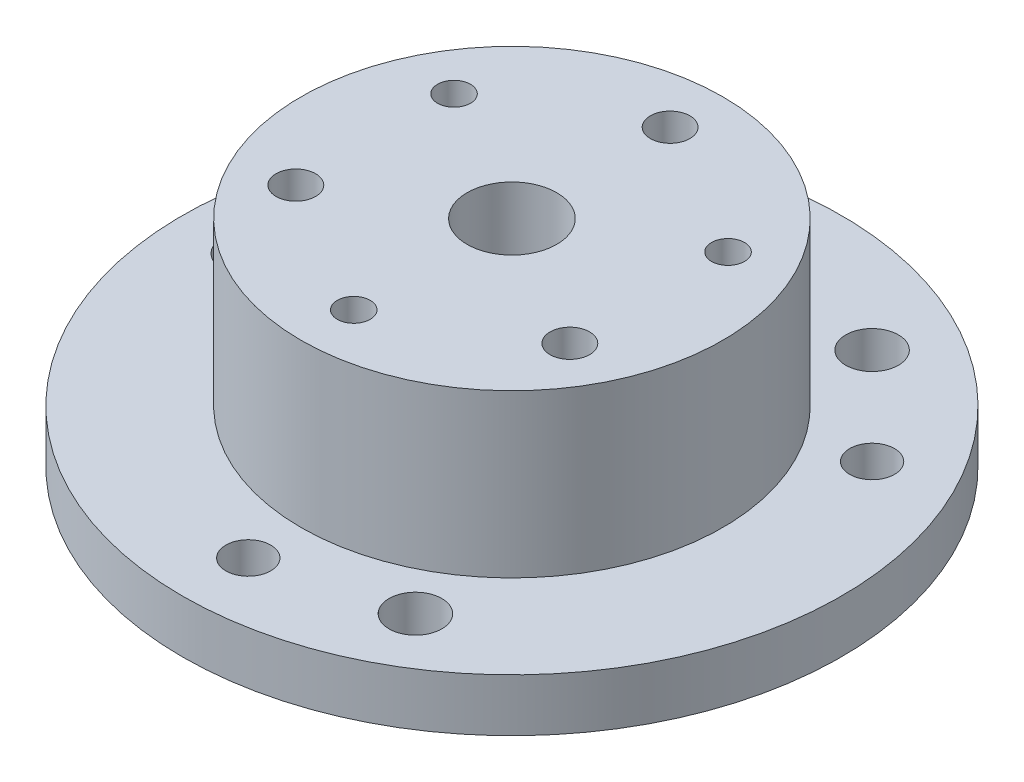
ISO-10303-21;
HEADER;
FILE_DESCRIPTION(('STEP AP214'),'2;1');
FILE_NAME('part.step','',(''),(''),'','','');
FILE_SCHEMA(('AUTOMOTIVE_DESIGN { 1 0 10303 214 1 1 1 1 }'));
ENDSEC;
DATA;
#1=APPLICATION_CONTEXT('core data for automotive mechanical design processes');
#2=APPLICATION_PROTOCOL_DEFINITION('international standard','automotive_design',2000,#1);
#3=PRODUCT_CONTEXT('',#1,'mechanical');
#4=PRODUCT('Part','Part','',(#3));
#5=PRODUCT_RELATED_PRODUCT_CATEGORY('part','',(#4));
#6=PRODUCT_DEFINITION_FORMATION('','',#4);
#7=PRODUCT_DEFINITION_CONTEXT('part definition',#1,'design');
#8=PRODUCT_DEFINITION('design','',#6,#7);
#9=PRODUCT_DEFINITION_SHAPE('','',#8);
#10=(LENGTH_UNIT() NAMED_UNIT(*) SI_UNIT(.MILLI.,.METRE.));
#11=(NAMED_UNIT(*) PLANE_ANGLE_UNIT() SI_UNIT($,.RADIAN.));
#12=(NAMED_UNIT(*) SI_UNIT($,.STERADIAN.) SOLID_ANGLE_UNIT());
#13=UNCERTAINTY_MEASURE_WITH_UNIT(LENGTH_MEASURE(1.E-05),#10,'distance_accuracy_value','');
#14=(GEOMETRIC_REPRESENTATION_CONTEXT(3) GLOBAL_UNCERTAINTY_ASSIGNED_CONTEXT((#13)) GLOBAL_UNIT_ASSIGNED_CONTEXT((#10,
#11,#12)) REPRESENTATION_CONTEXT('',''));
#15=CARTESIAN_POINT('',(0.,0.,0.));
#16=DIRECTION('',(0.,0.,1.));
#17=DIRECTION('',(1.,0.,0.));
#18=AXIS2_PLACEMENT_3D('',#15,#16,#17);
#19=CARTESIAN_POINT('',(0.,4.,0.));
#20=DIRECTION('',(0.,-1.,0.));
#21=DIRECTION('',(0.,0.,-1.));
#22=AXIS2_PLACEMENT_3D('',#19,#20,#21);
#23=CYLINDRICAL_SURFACE('',#22,25.);
#24=CARTESIAN_POINT('',(0.,4.,0.));
#25=DIRECTION('',(0.,1.,0.));
#26=DIRECTION('',(0.,0.,1.));
#27=AXIS2_PLACEMENT_3D('',#24,#25,#26);
#28=CIRCLE('',#27,25.);
#29=CARTESIAN_POINT('',(0.,4.,25.));
#30=VERTEX_POINT('',#29);
#31=EDGE_CURVE('E10',#30,#30,#28,.T.);
#32=ORIENTED_EDGE('',*,*,#31,.F.);
#33=EDGE_LOOP('',(#32));
#34=FACE_BOUND('',#33,.T.);
#35=CARTESIAN_POINT('',(0.,0.,0.));
#36=DIRECTION('',(0.,1.,0.));
#37=DIRECTION('',(0.,0.,1.));
#38=AXIS2_PLACEMENT_3D('',#35,#36,#37);
#39=CIRCLE('',#38,25.);
#40=CARTESIAN_POINT('',(0.,0.,25.));
#41=VERTEX_POINT('',#40);
#42=EDGE_CURVE('E48',#41,#41,#39,.T.);
#43=ORIENTED_EDGE('',*,*,#42,.T.);
#44=EDGE_LOOP('',(#43));
#45=FACE_BOUND('',#44,.T.);
#46=ADVANCED_FACE('F45',(#34,#45),#23,.T.);
#47=CARTESIAN_POINT('',(0.,4.,0.));
#48=DIRECTION('',(0.,1.,0.));
#49=DIRECTION('',(0.,0.,1.));
#50=AXIS2_PLACEMENT_3D('',#47,#48,#49);
#51=PLANE('',#50);
#52=CARTESIAN_POINT('',(0.,4.,0.));
#53=DIRECTION('',(0.,1.,0.));
#54=DIRECTION('',(0.,0.,1.));
#55=AXIS2_PLACEMENT_3D('',#52,#53,#54);
#56=CIRCLE('',#55,16.);
#57=CARTESIAN_POINT('',(0.,4.,16.));
#58=VERTEX_POINT('',#57);
#59=EDGE_CURVE('E106',#58,#58,#56,.F.);
#60=ORIENTED_EDGE('',*,*,#59,.T.);
#61=EDGE_LOOP('',(#60));
#62=FACE_BOUND('',#61,.T.);
#63=CARTESIAN_POINT('',(0.,4.,20.));
#64=DIRECTION('',(0.,1.,0.));
#65=DIRECTION('',(0.,0.,1.));
#66=AXIS2_PLACEMENT_3D('',#63,#64,#65);
#67=CIRCLE('',#66,1.7);
#68=CARTESIAN_POINT('',(0.,4.,21.7));
#69=VERTEX_POINT('',#68);
#70=EDGE_CURVE('E102',#69,#69,#67,.T.);
#71=ORIENTED_EDGE('',*,*,#70,.F.);
#72=EDGE_LOOP('',(#71));
#73=FACE_BOUND('',#72,.T.);
#74=CARTESIAN_POINT('',(-17.3205080756887,4.,-10.0000000000001));
#75=DIRECTION('',(0.,1.,0.));
#76=DIRECTION('',(0.,0.,1.));
#77=AXIS2_PLACEMENT_3D('',#74,#75,#76);
#78=CIRCLE('',#77,1.7);
#79=CARTESIAN_POINT('',(-17.3205080756887,4.,-8.30000000000008));
#80=VERTEX_POINT('',#79);
#81=EDGE_CURVE('E94',#80,#80,#78,.T.);
#82=ORIENTED_EDGE('',*,*,#81,.F.);
#83=EDGE_LOOP('',(#82));
#84=FACE_BOUND('',#83,.T.);
#85=CARTESIAN_POINT('',(17.3205080756889,4.,-9.99999999999984));
#86=DIRECTION('',(0.,1.,0.));
#87=DIRECTION('',(0.,0.,1.));
#88=AXIS2_PLACEMENT_3D('',#85,#86,#87);
#89=CIRCLE('',#88,1.7);
#90=CARTESIAN_POINT('',(17.3205080756889,4.,-8.29999999999984));
#91=VERTEX_POINT('',#90);
#92=EDGE_CURVE('E86',#91,#91,#89,.T.);
#93=ORIENTED_EDGE('',*,*,#92,.F.);
#94=EDGE_LOOP('',(#93));
#95=FACE_BOUND('',#94,.T.);
#96=CARTESIAN_POINT('',(-20.,4.,0.));
#97=DIRECTION('',(0.,1.,0.));
#98=DIRECTION('',(0.,0.,1.));
#99=AXIS2_PLACEMENT_3D('',#96,#97,#98);
#100=CIRCLE('',#99,2.);
#101=CARTESIAN_POINT('',(-20.,4.,2.));
#102=VERTEX_POINT('',#101);
#103=EDGE_CURVE('E78',#102,#102,#100,.T.);
#104=ORIENTED_EDGE('',*,*,#103,.F.);
#105=EDGE_LOOP('',(#104));
#106=FACE_BOUND('',#105,.T.);
#107=CARTESIAN_POINT('',(10.0000000000013,4.,-17.3205080756895));
#108=DIRECTION('',(0.,1.,0.));
#109=DIRECTION('',(0.,0.,1.));
#110=AXIS2_PLACEMENT_3D('',#107,#108,#109);
#111=CIRCLE('',#110,2.);
#112=CARTESIAN_POINT('',(10.0000000000013,4.,-15.3205080756895));
#113=VERTEX_POINT('',#112);
#114=EDGE_CURVE('E70',#113,#113,#111,.T.);
#115=ORIENTED_EDGE('',*,*,#114,.F.);
#116=EDGE_LOOP('',(#115));
#117=FACE_BOUND('',#116,.T.);
#118=CARTESIAN_POINT('',(10.0000000000013,4.,17.3205080756895));
#119=DIRECTION('',(0.,1.,0.));
#120=DIRECTION('',(0.,0.,1.));
#121=AXIS2_PLACEMENT_3D('',#118,#119,#120);
#122=CIRCLE('',#121,2.);
#123=CARTESIAN_POINT('',(10.0000000000013,4.,19.3205080756895));
#124=VERTEX_POINT('',#123);
#125=EDGE_CURVE('E62',#124,#124,#122,.T.);
#126=ORIENTED_EDGE('',*,*,#125,.F.);
#127=EDGE_LOOP('',(#126));
#128=FACE_BOUND('',#127,.T.);
#129=ORIENTED_EDGE('',*,*,#31,.T.);
#130=EDGE_LOOP('',(#129));
#131=FACE_BOUND('',#130,.T.);
#132=ADVANCED_FACE('F207',(#62,#73,#84,#95,#106,#117,#128,#131),#51,.T.);
#133=CARTESIAN_POINT('',(0.,0.,0.));
#134=DIRECTION('',(0.,1.,0.));
#135=DIRECTION('',(0.,0.,1.));
#136=AXIS2_PLACEMENT_3D('',#133,#134,#135);
#137=PLANE('',#136);
#138=CARTESIAN_POINT('',(0.,0.,12.));
#139=DIRECTION('',(0.,1.,0.));
#140=DIRECTION('',(0.,0.,1.));
#141=AXIS2_PLACEMENT_3D('',#138,#139,#140);
#142=CIRCLE('',#141,1.25);
#143=CARTESIAN_POINT('',(0.,0.,13.25));
#144=VERTEX_POINT('',#143);
#145=EDGE_CURVE('E162',#144,#144,#142,.T.);
#146=ORIENTED_EDGE('',*,*,#145,.T.);
#147=EDGE_LOOP('',(#146));
#148=FACE_BOUND('',#147,.T.);
#149=CARTESIAN_POINT('',(-10.3923048454132,0.,-6.00000000000005));
#150=DIRECTION('',(0.,1.,0.));
#151=DIRECTION('',(0.,0.,1.));
#152=AXIS2_PLACEMENT_3D('',#149,#150,#151);
#153=CIRCLE('',#152,1.25);
#154=CARTESIAN_POINT('',(-10.3923048454132,0.,-4.75000000000005));
#155=VERTEX_POINT('',#154);
#156=EDGE_CURVE('E154',#155,#155,#153,.T.);
#157=ORIENTED_EDGE('',*,*,#156,.T.);
#158=EDGE_LOOP('',(#157));
#159=FACE_BOUND('',#158,.T.);
#160=CARTESIAN_POINT('',(10.3923048454133,0.,-5.99999999999991));
#161=DIRECTION('',(0.,1.,0.));
#162=DIRECTION('',(0.,0.,1.));
#163=AXIS2_PLACEMENT_3D('',#160,#161,#162);
#164=CIRCLE('',#163,1.25);
#165=CARTESIAN_POINT('',(10.3923048454133,0.,-4.74999999999991));
#166=VERTEX_POINT('',#165);
#167=EDGE_CURVE('E146',#166,#166,#164,.T.);
#168=ORIENTED_EDGE('',*,*,#167,.T.);
#169=EDGE_LOOP('',(#168));
#170=FACE_BOUND('',#169,.T.);
#171=CARTESIAN_POINT('',(0.,0.,-12.));
#172=DIRECTION('',(0.,1.,0.));
#173=DIRECTION('',(0.,0.,1.));
#174=AXIS2_PLACEMENT_3D('',#171,#172,#173);
#175=CIRCLE('',#174,1.5);
#176=CARTESIAN_POINT('',(0.,0.,-10.5));
#177=VERTEX_POINT('',#176);
#178=EDGE_CURVE('E138',#177,#177,#175,.T.);
#179=ORIENTED_EDGE('',*,*,#178,.T.);
#180=EDGE_LOOP('',(#179));
#181=FACE_BOUND('',#180,.T.);
#182=CARTESIAN_POINT('',(10.392304845414,0.,5.99999999999956));
#183=DIRECTION('',(0.,1.,0.));
#184=DIRECTION('',(0.,0.,1.));
#185=AXIS2_PLACEMENT_3D('',#182,#183,#184);
#186=CIRCLE('',#185,1.5);
#187=CARTESIAN_POINT('',(10.392304845414,0.,7.49999999999955));
#188=VERTEX_POINT('',#187);
#189=EDGE_CURVE('E130',#188,#188,#186,.T.);
#190=ORIENTED_EDGE('',*,*,#189,.T.);
#191=EDGE_LOOP('',(#190));
#192=FACE_BOUND('',#191,.T.);
#193=CARTESIAN_POINT('',(-10.3923048454125,0.,6.00000000000044));
#194=DIRECTION('',(0.,1.,0.));
#195=DIRECTION('',(0.,0.,1.));
#196=AXIS2_PLACEMENT_3D('',#193,#194,#195);
#197=CIRCLE('',#196,1.5);
#198=CARTESIAN_POINT('',(-10.3923048454125,0.,7.50000000000043));
#199=VERTEX_POINT('',#198);
#200=EDGE_CURVE('E122',#199,#199,#197,.T.);
#201=ORIENTED_EDGE('',*,*,#200,.T.);
#202=EDGE_LOOP('',(#201));
#203=FACE_BOUND('',#202,.T.);
#204=CARTESIAN_POINT('',(0.,0.,0.));
#205=DIRECTION('',(0.,-1.,0.));
#206=DIRECTION('',(0.,0.,-1.));
#207=AXIS2_PLACEMENT_3D('',#204,#205,#206);
#208=CIRCLE('',#207,3.4);
#209=CARTESIAN_POINT('',(0.,0.,-3.4));
#210=VERTEX_POINT('',#209);
#211=EDGE_CURVE('E118',#210,#210,#208,.T.);
#212=ORIENTED_EDGE('',*,*,#211,.F.);
#213=EDGE_LOOP('',(#212));
#214=FACE_BOUND('',#213,.T.);
#215=CARTESIAN_POINT('',(0.,0.,20.));
#216=DIRECTION('',(0.,1.,0.));
#217=DIRECTION('',(0.,0.,1.));
#218=AXIS2_PLACEMENT_3D('',#215,#216,#217);
#219=CIRCLE('',#218,1.7);
#220=CARTESIAN_POINT('',(0.,0.,21.7));
#221=VERTEX_POINT('',#220);
#222=EDGE_CURVE('E98',#221,#221,#219,.T.);
#223=ORIENTED_EDGE('',*,*,#222,.T.);
#224=EDGE_LOOP('',(#223));
#225=FACE_BOUND('',#224,.T.);
#226=CARTESIAN_POINT('',(-17.3205080756887,0.,-10.0000000000001));
#227=DIRECTION('',(0.,1.,0.));
#228=DIRECTION('',(0.,0.,1.));
#229=AXIS2_PLACEMENT_3D('',#226,#227,#228);
#230=CIRCLE('',#229,1.7);
#231=CARTESIAN_POINT('',(-17.3205080756887,0.,-8.30000000000008));
#232=VERTEX_POINT('',#231);
#233=EDGE_CURVE('E90',#232,#232,#230,.T.);
#234=ORIENTED_EDGE('',*,*,#233,.T.);
#235=EDGE_LOOP('',(#234));
#236=FACE_BOUND('',#235,.T.);
#237=CARTESIAN_POINT('',(17.3205080756889,0.,-9.99999999999984));
#238=DIRECTION('',(0.,1.,0.));
#239=DIRECTION('',(0.,0.,1.));
#240=AXIS2_PLACEMENT_3D('',#237,#238,#239);
#241=CIRCLE('',#240,1.7);
#242=CARTESIAN_POINT('',(17.3205080756889,0.,-8.29999999999984));
#243=VERTEX_POINT('',#242);
#244=EDGE_CURVE('E82',#243,#243,#241,.T.);
#245=ORIENTED_EDGE('',*,*,#244,.T.);
#246=EDGE_LOOP('',(#245));
#247=FACE_BOUND('',#246,.T.);
#248=CARTESIAN_POINT('',(-20.,0.,0.));
#249=DIRECTION('',(0.,1.,0.));
#250=DIRECTION('',(0.,0.,1.));
#251=AXIS2_PLACEMENT_3D('',#248,#249,#250);
#252=CIRCLE('',#251,2.);
#253=CARTESIAN_POINT('',(-20.,0.,2.));
#254=VERTEX_POINT('',#253);
#255=EDGE_CURVE('E74',#254,#254,#252,.T.);
#256=ORIENTED_EDGE('',*,*,#255,.T.);
#257=EDGE_LOOP('',(#256));
#258=FACE_BOUND('',#257,.T.);
#259=CARTESIAN_POINT('',(10.0000000000013,0.,-17.3205080756895));
#260=DIRECTION('',(0.,1.,0.));
#261=DIRECTION('',(0.,0.,1.));
#262=AXIS2_PLACEMENT_3D('',#259,#260,#261);
#263=CIRCLE('',#262,2.);
#264=CARTESIAN_POINT('',(10.0000000000013,0.,-15.3205080756895));
#265=VERTEX_POINT('',#264);
#266=EDGE_CURVE('E66',#265,#265,#263,.T.);
#267=ORIENTED_EDGE('',*,*,#266,.T.);
#268=EDGE_LOOP('',(#267));
#269=FACE_BOUND('',#268,.T.);
#270=CARTESIAN_POINT('',(10.0000000000013,0.,17.3205080756895));
#271=DIRECTION('',(0.,1.,0.));
#272=DIRECTION('',(0.,0.,1.));
#273=AXIS2_PLACEMENT_3D('',#270,#271,#272);
#274=CIRCLE('',#273,2.);
#275=CARTESIAN_POINT('',(10.0000000000013,0.,19.3205080756895));
#276=VERTEX_POINT('',#275);
#277=EDGE_CURVE('E57',#276,#276,#274,.T.);
#278=ORIENTED_EDGE('',*,*,#277,.T.);
#279=EDGE_LOOP('',(#278));
#280=FACE_BOUND('',#279,.T.);
#281=ORIENTED_EDGE('',*,*,#42,.F.);
#282=EDGE_LOOP('',(#281));
#283=FACE_BOUND('',#282,.T.);
#284=ADVANCED_FACE('F212',(#148,#159,#170,#181,#192,#203,#214,#225,#236,#247,#258,#269,#280,
#283),#137,.F.);
#285=CARTESIAN_POINT('',(10.0000000000013,4.,17.3205080756895));
#286=DIRECTION('',(0.,1.,0.));
#287=DIRECTION('',(0.,0.,1.));
#288=AXIS2_PLACEMENT_3D('',#285,#286,#287);
#289=CYLINDRICAL_SURFACE('',#288,2.);
#290=ORIENTED_EDGE('',*,*,#277,.F.);
#291=EDGE_LOOP('',(#290));
#292=FACE_BOUND('',#291,.T.);
#293=ORIENTED_EDGE('',*,*,#125,.T.);
#294=EDGE_LOOP('',(#293));
#295=FACE_BOUND('',#294,.T.);
#296=ADVANCED_FACE('F219',(#292,#295),#289,.F.);
#297=CARTESIAN_POINT('',(10.0000000000013,4.,-17.3205080756895));
#298=DIRECTION('',(0.,1.,0.));
#299=DIRECTION('',(0.,0.,1.));
#300=AXIS2_PLACEMENT_3D('',#297,#298,#299);
#301=CYLINDRICAL_SURFACE('',#300,2.);
#302=ORIENTED_EDGE('',*,*,#266,.F.);
#303=EDGE_LOOP('',(#302));
#304=FACE_BOUND('',#303,.T.);
#305=ORIENTED_EDGE('',*,*,#114,.T.);
#306=EDGE_LOOP('',(#305));
#307=FACE_BOUND('',#306,.T.);
#308=ADVANCED_FACE('F224',(#304,#307),#301,.F.);
#309=CARTESIAN_POINT('',(-20.,4.,0.));
#310=DIRECTION('',(0.,1.,0.));
#311=DIRECTION('',(0.,0.,1.));
#312=AXIS2_PLACEMENT_3D('',#309,#310,#311);
#313=CYLINDRICAL_SURFACE('',#312,2.);
#314=ORIENTED_EDGE('',*,*,#255,.F.);
#315=EDGE_LOOP('',(#314));
#316=FACE_BOUND('',#315,.T.);
#317=ORIENTED_EDGE('',*,*,#103,.T.);
#318=EDGE_LOOP('',(#317));
#319=FACE_BOUND('',#318,.T.);
#320=ADVANCED_FACE('F231',(#316,#319),#313,.F.);
#321=CARTESIAN_POINT('',(17.3205080756889,4.,-9.99999999999984));
#322=DIRECTION('',(0.,1.,0.));
#323=DIRECTION('',(0.,0.,1.));
#324=AXIS2_PLACEMENT_3D('',#321,#322,#323);
#325=CYLINDRICAL_SURFACE('',#324,1.7);
#326=ORIENTED_EDGE('',*,*,#244,.F.);
#327=EDGE_LOOP('',(#326));
#328=FACE_BOUND('',#327,.T.);
#329=ORIENTED_EDGE('',*,*,#92,.T.);
#330=EDGE_LOOP('',(#329));
#331=FACE_BOUND('',#330,.T.);
#332=ADVANCED_FACE('F235',(#328,#331),#325,.F.);
#333=CARTESIAN_POINT('',(-17.3205080756887,4.,-10.0000000000001));
#334=DIRECTION('',(0.,1.,0.));
#335=DIRECTION('',(0.,0.,1.));
#336=AXIS2_PLACEMENT_3D('',#333,#334,#335);
#337=CYLINDRICAL_SURFACE('',#336,1.7);
#338=ORIENTED_EDGE('',*,*,#233,.F.);
#339=EDGE_LOOP('',(#338));
#340=FACE_BOUND('',#339,.T.);
#341=ORIENTED_EDGE('',*,*,#81,.T.);
#342=EDGE_LOOP('',(#341));
#343=FACE_BOUND('',#342,.T.);
#344=ADVANCED_FACE('F202',(#340,#343),#337,.F.);
#345=CARTESIAN_POINT('',(0.,4.,20.));
#346=DIRECTION('',(0.,1.,0.));
#347=DIRECTION('',(0.,0.,1.));
#348=AXIS2_PLACEMENT_3D('',#345,#346,#347);
#349=CYLINDRICAL_SURFACE('',#348,1.7);
#350=ORIENTED_EDGE('',*,*,#222,.F.);
#351=EDGE_LOOP('',(#350));
#352=FACE_BOUND('',#351,.T.);
#353=ORIENTED_EDGE('',*,*,#70,.T.);
#354=EDGE_LOOP('',(#353));
#355=FACE_BOUND('',#354,.T.);
#356=ADVANCED_FACE('F194',(#352,#355),#349,.F.);
#357=CARTESIAN_POINT('',(0.,16.3,0.));
#358=DIRECTION('',(0.,-1.,0.));
#359=DIRECTION('',(0.,0.,-1.));
#360=AXIS2_PLACEMENT_3D('',#357,#358,#359);
#361=CYLINDRICAL_SURFACE('',#360,16.);
#362=ORIENTED_EDGE('',*,*,#59,.F.);
#363=EDGE_LOOP('',(#362));
#364=FACE_BOUND('',#363,.T.);
#365=CARTESIAN_POINT('',(0.,16.3,0.));
#366=DIRECTION('',(0.,1.,0.));
#367=DIRECTION('',(0.,0.,1.));
#368=AXIS2_PLACEMENT_3D('',#365,#366,#367);
#369=CIRCLE('',#368,16.);
#370=CARTESIAN_POINT('',(0.,16.3,16.));
#371=VERTEX_POINT('',#370);
#372=EDGE_CURVE('E110',#371,#371,#369,.T.);
#373=ORIENTED_EDGE('',*,*,#372,.F.);
#374=EDGE_LOOP('',(#373));
#375=FACE_BOUND('',#374,.T.);
#376=ADVANCED_FACE('F177',(#364,#375),#361,.T.);
#377=CARTESIAN_POINT('',(0.,16.3,0.));
#378=DIRECTION('',(0.,1.,0.));
#379=DIRECTION('',(0.,0.,1.));
#380=AXIS2_PLACEMENT_3D('',#377,#378,#379);
#381=PLANE('',#380);
#382=CARTESIAN_POINT('',(0.,16.3,12.));
#383=DIRECTION('',(0.,1.,0.));
#384=DIRECTION('',(0.,0.,1.));
#385=AXIS2_PLACEMENT_3D('',#382,#383,#384);
#386=CIRCLE('',#385,1.25);
#387=CARTESIAN_POINT('',(0.,16.3,13.25));
#388=VERTEX_POINT('',#387);
#389=EDGE_CURVE('E166',#388,#388,#386,.T.);
#390=ORIENTED_EDGE('',*,*,#389,.F.);
#391=EDGE_LOOP('',(#390));
#392=FACE_BOUND('',#391,.T.);
#393=CARTESIAN_POINT('',(-10.3923048454132,16.3,-6.00000000000005));
#394=DIRECTION('',(0.,1.,0.));
#395=DIRECTION('',(0.,0.,1.));
#396=AXIS2_PLACEMENT_3D('',#393,#394,#395);
#397=CIRCLE('',#396,1.25);
#398=CARTESIAN_POINT('',(-10.3923048454132,16.3,-4.75000000000005));
#399=VERTEX_POINT('',#398);
#400=EDGE_CURVE('E158',#399,#399,#397,.T.);
#401=ORIENTED_EDGE('',*,*,#400,.F.);
#402=EDGE_LOOP('',(#401));
#403=FACE_BOUND('',#402,.T.);
#404=CARTESIAN_POINT('',(10.3923048454133,16.3,-5.99999999999991));
#405=DIRECTION('',(0.,1.,0.));
#406=DIRECTION('',(0.,0.,1.));
#407=AXIS2_PLACEMENT_3D('',#404,#405,#406);
#408=CIRCLE('',#407,1.25);
#409=CARTESIAN_POINT('',(10.3923048454133,16.3,-4.74999999999991));
#410=VERTEX_POINT('',#409);
#411=EDGE_CURVE('E150',#410,#410,#408,.T.);
#412=ORIENTED_EDGE('',*,*,#411,.F.);
#413=EDGE_LOOP('',(#412));
#414=FACE_BOUND('',#413,.T.);
#415=CARTESIAN_POINT('',(0.,16.3,-12.));
#416=DIRECTION('',(0.,1.,0.));
#417=DIRECTION('',(0.,0.,1.));
#418=AXIS2_PLACEMENT_3D('',#415,#416,#417);
#419=CIRCLE('',#418,1.5);
#420=CARTESIAN_POINT('',(0.,16.3,-10.5));
#421=VERTEX_POINT('',#420);
#422=EDGE_CURVE('E142',#421,#421,#419,.T.);
#423=ORIENTED_EDGE('',*,*,#422,.F.);
#424=EDGE_LOOP('',(#423));
#425=FACE_BOUND('',#424,.T.);
#426=CARTESIAN_POINT('',(10.392304845414,16.3,5.99999999999956));
#427=DIRECTION('',(0.,1.,0.));
#428=DIRECTION('',(0.,0.,1.));
#429=AXIS2_PLACEMENT_3D('',#426,#427,#428);
#430=CIRCLE('',#429,1.5);
#431=CARTESIAN_POINT('',(10.392304845414,16.3,7.49999999999956));
#432=VERTEX_POINT('',#431);
#433=EDGE_CURVE('E134',#432,#432,#430,.T.);
#434=ORIENTED_EDGE('',*,*,#433,.F.);
#435=EDGE_LOOP('',(#434));
#436=FACE_BOUND('',#435,.T.);
#437=CARTESIAN_POINT('',(-10.3923048454125,16.3,6.00000000000044));
#438=DIRECTION('',(0.,1.,0.));
#439=DIRECTION('',(0.,0.,1.));
#440=AXIS2_PLACEMENT_3D('',#437,#438,#439);
#441=CIRCLE('',#440,1.5);
#442=CARTESIAN_POINT('',(-10.3923048454125,16.3,7.50000000000044));
#443=VERTEX_POINT('',#442);
#444=EDGE_CURVE('E126',#443,#443,#441,.T.);
#445=ORIENTED_EDGE('',*,*,#444,.F.);
#446=EDGE_LOOP('',(#445));
#447=FACE_BOUND('',#446,.T.);
#448=CARTESIAN_POINT('',(0.,16.3,0.));
#449=DIRECTION('',(0.,-1.,0.));
#450=DIRECTION('',(0.,0.,-1.));
#451=AXIS2_PLACEMENT_3D('',#448,#449,#450);
#452=CIRCLE('',#451,3.4);
#453=CARTESIAN_POINT('',(0.,16.3,-3.4));
#454=VERTEX_POINT('',#453);
#455=EDGE_CURVE('E114',#454,#454,#452,.T.);
#456=ORIENTED_EDGE('',*,*,#455,.T.);
#457=EDGE_LOOP('',(#456));
#458=FACE_BOUND('',#457,.T.);
#459=ORIENTED_EDGE('',*,*,#372,.T.);
#460=EDGE_LOOP('',(#459));
#461=FACE_BOUND('',#460,.T.);
#462=ADVANCED_FACE('F173',(#392,#403,#414,#425,#436,#447,#458,#461),#381,.T.);
#463=CARTESIAN_POINT('',(0.,0.,0.));
#464=DIRECTION('',(0.,-1.,0.));
#465=DIRECTION('',(0.,0.,-1.));
#466=AXIS2_PLACEMENT_3D('',#463,#464,#465);
#467=CYLINDRICAL_SURFACE('',#466,3.4);
#468=ORIENTED_EDGE('',*,*,#455,.F.);
#469=EDGE_LOOP('',(#468));
#470=FACE_BOUND('',#469,.T.);
#471=ORIENTED_EDGE('',*,*,#211,.T.);
#472=EDGE_LOOP('',(#471));
#473=FACE_BOUND('',#472,.T.);
#474=ADVANCED_FACE('F176',(#470,#473),#467,.F.);
#475=CARTESIAN_POINT('',(-10.3923048454125,16.3,6.00000000000044));
#476=DIRECTION('',(0.,1.,0.));
#477=DIRECTION('',(0.,0.,1.));
#478=AXIS2_PLACEMENT_3D('',#475,#476,#477);
#479=CYLINDRICAL_SURFACE('',#478,1.5);
#480=ORIENTED_EDGE('',*,*,#200,.F.);
#481=EDGE_LOOP('',(#480));
#482=FACE_BOUND('',#481,.T.);
#483=ORIENTED_EDGE('',*,*,#444,.T.);
#484=EDGE_LOOP('',(#483));
#485=FACE_BOUND('',#484,.T.);
#486=ADVANCED_FACE('F329',(#482,#485),#479,.F.);
#487=CARTESIAN_POINT('',(10.392304845414,16.3,5.99999999999956));
#488=DIRECTION('',(0.,1.,0.));
#489=DIRECTION('',(0.,0.,1.));
#490=AXIS2_PLACEMENT_3D('',#487,#488,#489);
#491=CYLINDRICAL_SURFACE('',#490,1.5);
#492=ORIENTED_EDGE('',*,*,#189,.F.);
#493=EDGE_LOOP('',(#492));
#494=FACE_BOUND('',#493,.T.);
#495=ORIENTED_EDGE('',*,*,#433,.T.);
#496=EDGE_LOOP('',(#495));
#497=FACE_BOUND('',#496,.T.);
#498=ADVANCED_FACE('F338',(#494,#497),#491,.F.);
#499=CARTESIAN_POINT('',(0.,16.3,-12.));
#500=DIRECTION('',(0.,1.,0.));
#501=DIRECTION('',(0.,0.,1.));
#502=AXIS2_PLACEMENT_3D('',#499,#500,#501);
#503=CYLINDRICAL_SURFACE('',#502,1.5);
#504=ORIENTED_EDGE('',*,*,#178,.F.);
#505=EDGE_LOOP('',(#504));
#506=FACE_BOUND('',#505,.T.);
#507=ORIENTED_EDGE('',*,*,#422,.T.);
#508=EDGE_LOOP('',(#507));
#509=FACE_BOUND('',#508,.T.);
#510=ADVANCED_FACE('F347',(#506,#509),#503,.F.);
#511=CARTESIAN_POINT('',(10.3923048454133,16.3,-5.99999999999991));
#512=DIRECTION('',(0.,1.,0.));
#513=DIRECTION('',(0.,0.,1.));
#514=AXIS2_PLACEMENT_3D('',#511,#512,#513);
#515=CYLINDRICAL_SURFACE('',#514,1.25);
#516=ORIENTED_EDGE('',*,*,#167,.F.);
#517=EDGE_LOOP('',(#516));
#518=FACE_BOUND('',#517,.T.);
#519=ORIENTED_EDGE('',*,*,#411,.T.);
#520=EDGE_LOOP('',(#519));
#521=FACE_BOUND('',#520,.T.);
#522=ADVANCED_FACE('F355',(#518,#521),#515,.F.);
#523=CARTESIAN_POINT('',(-10.3923048454132,16.3,-6.00000000000005));
#524=DIRECTION('',(0.,1.,0.));
#525=DIRECTION('',(0.,0.,1.));
#526=AXIS2_PLACEMENT_3D('',#523,#524,#525);
#527=CYLINDRICAL_SURFACE('',#526,1.25);
#528=ORIENTED_EDGE('',*,*,#156,.F.);
#529=EDGE_LOOP('',(#528));
#530=FACE_BOUND('',#529,.T.);
#531=ORIENTED_EDGE('',*,*,#400,.T.);
#532=EDGE_LOOP('',(#531));
#533=FACE_BOUND('',#532,.T.);
#534=ADVANCED_FACE('F364',(#530,#533),#527,.F.);
#535=CARTESIAN_POINT('',(0.,16.3,12.));
#536=DIRECTION('',(0.,1.,0.));
#537=DIRECTION('',(0.,0.,1.));
#538=AXIS2_PLACEMENT_3D('',#535,#536,#537);
#539=CYLINDRICAL_SURFACE('',#538,1.25);
#540=ORIENTED_EDGE('',*,*,#145,.F.);
#541=EDGE_LOOP('',(#540));
#542=FACE_BOUND('',#541,.T.);
#543=ORIENTED_EDGE('',*,*,#389,.T.);
#544=EDGE_LOOP('',(#543));
#545=FACE_BOUND('',#544,.T.);
#546=ADVANCED_FACE('F171',(#542,#545),#539,.F.);
#547=CLOSED_SHELL('',(#46,#132,#284,#296,#308,#320,#332,#344,#356,#376,#462,#474,#486,#498,#510,
#522,#534,#546));
#548=MANIFOLD_SOLID_BREP('B2',#547);
#549=ADVANCED_BREP_SHAPE_REPRESENTATION('',(#18,#548),#14);
#550=SHAPE_DEFINITION_REPRESENTATION(#9,#549);
ENDSEC;
END-ISO-10303-21;
